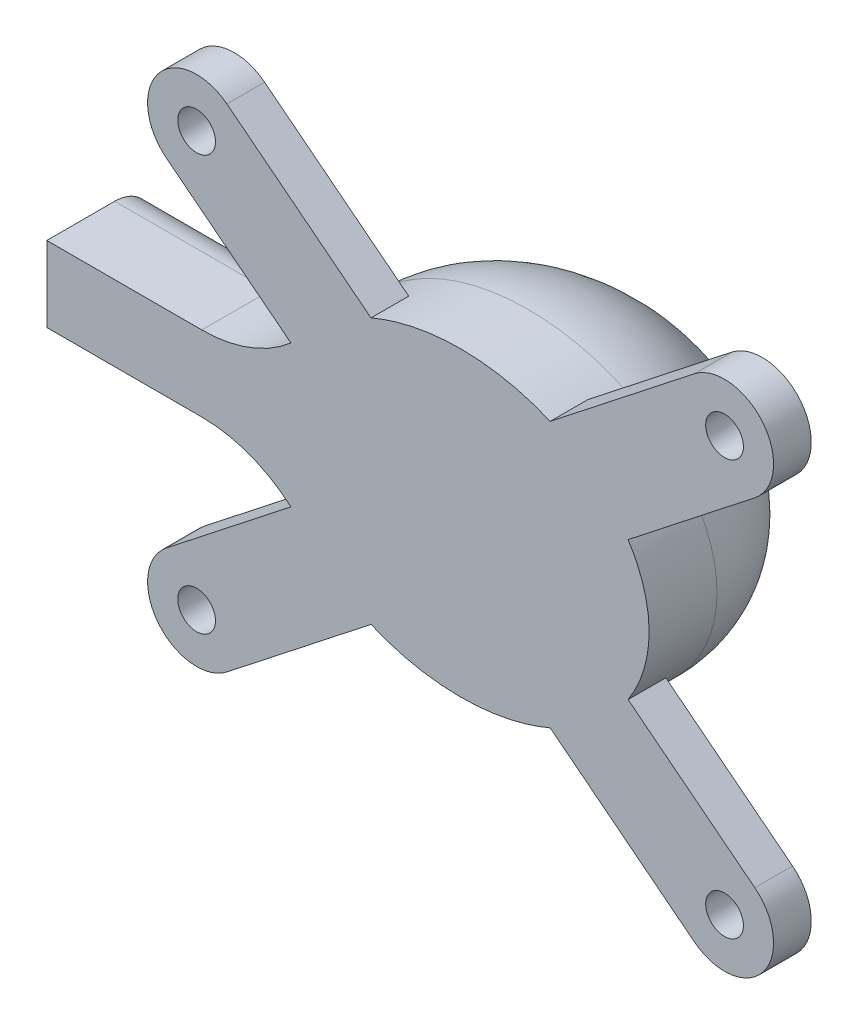
ISO-10303-21;
HEADER;
FILE_DESCRIPTION(('STEP AP214'),'2;1');
FILE_NAME('part.step','',(''),(''),'','','');
FILE_SCHEMA(('AUTOMOTIVE_DESIGN { 1 0 10303 214 1 1 1 1 }'));
ENDSEC;
DATA;
#1=APPLICATION_CONTEXT('core data for automotive mechanical design processes');
#2=APPLICATION_PROTOCOL_DEFINITION('international standard','automotive_design',2000,#1);
#3=PRODUCT_CONTEXT('',#1,'mechanical');
#4=PRODUCT('Part','Part','',(#3));
#5=PRODUCT_RELATED_PRODUCT_CATEGORY('part','',(#4));
#6=PRODUCT_DEFINITION_FORMATION('','',#4);
#7=PRODUCT_DEFINITION_CONTEXT('part definition',#1,'design');
#8=PRODUCT_DEFINITION('design','',#6,#7);
#9=PRODUCT_DEFINITION_SHAPE('','',#8);
#10=(LENGTH_UNIT() NAMED_UNIT(*) SI_UNIT(.MILLI.,.METRE.));
#11=(NAMED_UNIT(*) PLANE_ANGLE_UNIT() SI_UNIT($,.RADIAN.));
#12=(NAMED_UNIT(*) SI_UNIT($,.STERADIAN.) SOLID_ANGLE_UNIT());
#13=UNCERTAINTY_MEASURE_WITH_UNIT(LENGTH_MEASURE(1.E-05),#10,'distance_accuracy_value','');
#14=(GEOMETRIC_REPRESENTATION_CONTEXT(3) GLOBAL_UNCERTAINTY_ASSIGNED_CONTEXT((#13)) GLOBAL_UNIT_ASSIGNED_CONTEXT((#10,
#11,#12)) REPRESENTATION_CONTEXT('',''));
#15=CARTESIAN_POINT('',(0.,0.,0.));
#16=DIRECTION('',(0.,0.,1.));
#17=DIRECTION('',(1.,0.,0.));
#18=AXIS2_PLACEMENT_3D('',#15,#16,#17);
#19=CARTESIAN_POINT('',(-54.865727699422,-5.,9.));
#20=DIRECTION('',(0.,1.,0.));
#21=DIRECTION('',(0.,0.,1.));
#22=AXIS2_PLACEMENT_3D('',#19,#20,#21);
#23=PLANE('',#22);
#24=DIRECTION('',(-1.,0.,0.));
#25=VECTOR('',#24,1.);
#26=CARTESIAN_POINT('',(-14.6473229179582,-5.,0.));
#27=LINE('',#26,#25);
#28=CARTESIAN_POINT('',(-34.3060891721499,-5.,0.));
#29=VERTEX_POINT('',#28);
#30=CARTESIAN_POINT('',(-54.865727699422,-5.,0.));
#31=VERTEX_POINT('',#30);
#32=EDGE_CURVE('E296',#29,#31,#27,.T.);
#33=ORIENTED_EDGE('',*,*,#32,.F.);
#34=DIRECTION('',(0.,0.,1.));
#35=VECTOR('',#34,1.);
#36=CARTESIAN_POINT('',(-34.3060891721499,-5.,9.));
#37=LINE('',#36,#35);
#38=CARTESIAN_POINT('',(-34.3060891721499,-5.,9.));
#39=VERTEX_POINT('',#38);
#40=EDGE_CURVE('E364',#29,#39,#37,.T.);
#41=ORIENTED_EDGE('',*,*,#40,.T.);
#42=DIRECTION('',(1.,0.,0.));
#43=VECTOR('',#42,1.);
#44=CARTESIAN_POINT('',(-54.865727699422,-5.,9.));
#45=LINE('',#44,#43);
#46=CARTESIAN_POINT('',(-54.865727699422,-5.,9.));
#47=VERTEX_POINT('',#46);
#48=EDGE_CURVE('E280',#47,#39,#45,.T.);
#49=ORIENTED_EDGE('',*,*,#48,.F.);
#50=DIRECTION('',(0.,0.,-1.));
#51=VECTOR('',#50,1.);
#52=CARTESIAN_POINT('',(-54.865727699422,-5.,9.));
#53=LINE('',#52,#51);
#54=EDGE_CURVE('E290',#47,#31,#53,.T.);
#55=ORIENTED_EDGE('',*,*,#54,.T.);
#56=EDGE_LOOP('',(#33,#41,#49,#55));
#57=FACE_BOUND('',#56,.T.);
#58=ADVANCED_FACE('F39',(#57),#23,.F.);
#59=CARTESIAN_POINT('',(-54.865727699422,5.,9.));
#60=DIRECTION('',(0.,-1.,0.));
#61=DIRECTION('',(0.,0.,-1.));
#62=AXIS2_PLACEMENT_3D('',#59,#60,#61);
#63=PLANE('',#62);
#64=DIRECTION('',(-1.,0.,0.));
#65=VECTOR('',#64,1.);
#66=CARTESIAN_POINT('',(-54.865727699422,5.,9.));
#67=LINE('',#66,#65);
#68=CARTESIAN_POINT('',(-34.3060891721499,5.,9.));
#69=VERTEX_POINT('',#68);
#70=CARTESIAN_POINT('',(-54.865727699422,5.,9.));
#71=VERTEX_POINT('',#70);
#72=EDGE_CURVE('E283',#69,#71,#67,.T.);
#73=ORIENTED_EDGE('',*,*,#72,.F.);
#74=DIRECTION('',(0.,0.,1.));
#75=VECTOR('',#74,1.);
#76=CARTESIAN_POINT('',(-34.3060891721499,5.,0.));
#77=LINE('',#76,#75);
#78=CARTESIAN_POINT('',(-34.3060891721499,5.,0.));
#79=VERTEX_POINT('',#78);
#80=EDGE_CURVE('E396',#69,#79,#77,.F.);
#81=ORIENTED_EDGE('',*,*,#80,.T.);
#82=DIRECTION('',(-1.,0.,0.));
#83=VECTOR('',#82,1.);
#84=CARTESIAN_POINT('',(-14.6473229179582,5.,0.));
#85=LINE('',#84,#83);
#86=CARTESIAN_POINT('',(-54.865727699422,5.,0.));
#87=VERTEX_POINT('',#86);
#88=EDGE_CURVE('E293',#79,#87,#85,.T.);
#89=ORIENTED_EDGE('',*,*,#88,.T.);
#90=DIRECTION('',(0.,0.,-1.));
#91=VECTOR('',#90,1.);
#92=CARTESIAN_POINT('',(-54.865727699422,5.,9.));
#93=LINE('',#92,#91);
#94=EDGE_CURVE('E286',#71,#87,#93,.T.);
#95=ORIENTED_EDGE('',*,*,#94,.F.);
#96=EDGE_LOOP('',(#73,#81,#89,#95));
#97=FACE_BOUND('',#96,.T.);
#98=ADVANCED_FACE('F339',(#97),#63,.F.);
#99=CARTESIAN_POINT('',(-35.,-27.5,4.));
#100=DIRECTION('',(0.,0.,1.));
#101=DIRECTION('',(1.,0.,0.));
#102=AXIS2_PLACEMENT_3D('',#99,#100,#101);
#103=PLANE('',#102);
#104=CARTESIAN_POINT('',(0.,0.,4.));
#105=DIRECTION('',(0.,0.,1.));
#106=DIRECTION('',(1.,0.,0.));
#107=AXIS2_PLACEMENT_3D('',#104,#105,#106);
#108=ELLIPSE('',#107,25.,20.);
#109=CARTESIAN_POINT('',(22.2087408965514,-9.1833528618638,4.));
#110=VERTEX_POINT('',#109);
#111=CARTESIAN_POINT('',(11.8774528933401,-17.5986565444795,4.));
#112=VERTEX_POINT('',#111);
#113=EDGE_CURVE('E438',#110,#112,#108,.F.);
#114=ORIENTED_EDGE('',*,*,#113,.F.);
#115=DIRECTION('',(-0.786318338822423,0.617821551931903,0.));
#116=VECTOR('',#115,1.);
#117=CARTESIAN_POINT('',(10.5208372541793,0.,4.));
#118=LINE('',#117,#116);
#119=CARTESIAN_POINT('',(39.0158400875574,-22.3889307976542,4.));
#120=VERTEX_POINT('',#119);
#121=EDGE_CURVE('E499',#120,#110,#118,.T.);
#122=ORIENTED_EDGE('',*,*,#121,.F.);
#123=CARTESIAN_POINT('',(35.,-27.5,4.));
#124=DIRECTION('',(0.,0.,1.));
#125=DIRECTION('',(1.,0.,0.));
#126=AXIS2_PLACEMENT_3D('',#123,#124,#125);
#127=CIRCLE('',#126,6.50000000000001);
#128=CARTESIAN_POINT('',(30.9841599124426,-32.6110692023458,4.));
#129=VERTEX_POINT('',#128);
#130=EDGE_CURVE('E495',#129,#120,#127,.T.);
#131=ORIENTED_EDGE('',*,*,#130,.F.);
#132=DIRECTION('',(0.786318338822423,-0.617821551931903,0.));
#133=VECTOR('',#132,1.);
#134=CARTESIAN_POINT('',(0.,-8.2663721282837,4.));
#135=LINE('',#134,#133);
#136=EDGE_CURVE('E492',#112,#129,#135,.T.);
#137=ORIENTED_EDGE('',*,*,#136,.F.);
#138=EDGE_LOOP('',(#114,#122,#131,#137));
#139=FACE_BOUND('',#138,.T.);
#140=CARTESIAN_POINT('',(35.,-27.5,4.));
#141=DIRECTION('',(0.,0.,1.));
#142=DIRECTION('',(1.,0.,0.));
#143=AXIS2_PLACEMENT_3D('',#140,#141,#142);
#144=CIRCLE('',#143,2.5);
#145=CARTESIAN_POINT('',(37.5,-27.5,4.));
#146=VERTEX_POINT('',#145);
#147=EDGE_CURVE('E432',#146,#146,#144,.T.);
#148=ORIENTED_EDGE('',*,*,#147,.T.);
#149=EDGE_LOOP('',(#148));
#150=FACE_BOUND('',#149,.T.);
#151=ADVANCED_FACE('F345',(#139,#150),#103,.F.);
#152=DIRECTION('',(-0.786318338822423,-0.617821551931904,0.));
#153=VECTOR('',#152,1.);
#154=CARTESIAN_POINT('',(-39.0158400875574,-22.3889307976543,4.));
#155=LINE('',#154,#153);
#156=CARTESIAN_POINT('',(-22.500268423521,-9.4124102044828,4.));
#157=VERTEX_POINT('',#156);
#158=CARTESIAN_POINT('',(-39.0158400875574,-22.3889307976543,4.));
#159=VERTEX_POINT('',#158);
#160=EDGE_CURVE('E276',#157,#159,#155,.T.);
#161=ORIENTED_EDGE('',*,*,#160,.F.);
#162=CARTESIAN_POINT('',(-34.3060891721499,-23.,4.));
#163=DIRECTION('',(0.,0.,1.));
#164=DIRECTION('',(1.,0.,0.));
#165=AXIS2_PLACEMENT_3D('',#162,#163,#164);
#166=CIRCLE('',#165,18.);
#167=CARTESIAN_POINT('',(-20.6295359356946,-11.2973553599879,4.));
#168=VERTEX_POINT('',#167);
#169=EDGE_CURVE('E403',#157,#168,#166,.F.);
#170=ORIENTED_EDGE('',*,*,#169,.T.);
#171=CARTESIAN_POINT('',(-11.8774528933401,-17.5986565444795,4.));
#172=VERTEX_POINT('',#171);
#173=EDGE_CURVE('E428',#172,#168,#108,.F.);
#174=ORIENTED_EDGE('',*,*,#173,.F.);
#175=DIRECTION('',(0.786318338822423,0.617821551931903,0.));
#176=VECTOR('',#175,1.);
#177=CARTESIAN_POINT('',(-30.9841599124426,-32.6110692023458,4.));
#178=LINE('',#177,#176);
#179=CARTESIAN_POINT('',(-30.9841599124426,-32.6110692023458,4.));
#180=VERTEX_POINT('',#179);
#181=EDGE_CURVE('E488',#180,#172,#178,.T.);
#182=ORIENTED_EDGE('',*,*,#181,.F.);
#183=CARTESIAN_POINT('',(-35.,-27.5,4.));
#184=DIRECTION('',(0.,0.,1.));
#185=DIRECTION('',(1.,0.,0.));
#186=AXIS2_PLACEMENT_3D('',#183,#184,#185);
#187=CIRCLE('',#186,6.5);
#188=EDGE_CURVE('E248',#159,#180,#187,.T.);
#189=ORIENTED_EDGE('',*,*,#188,.F.);
#190=EDGE_LOOP('',(#161,#170,#174,#182,#189));
#191=FACE_BOUND('',#190,.T.);
#192=CARTESIAN_POINT('',(-35.,-27.5,4.));
#193=DIRECTION('',(0.,0.,1.));
#194=DIRECTION('',(1.,0.,0.));
#195=AXIS2_PLACEMENT_3D('',#192,#193,#194);
#196=CIRCLE('',#195,2.50000000000001);
#197=CARTESIAN_POINT('',(-32.5,-27.5,4.));
#198=VERTEX_POINT('',#197);
#199=EDGE_CURVE('E477',#198,#198,#196,.T.);
#200=ORIENTED_EDGE('',*,*,#199,.T.);
#201=EDGE_LOOP('',(#200));
#202=FACE_BOUND('',#201,.T.);
#203=ADVANCED_FACE('F580',(#191,#202),#103,.F.);
#204=CARTESIAN_POINT('',(-20.6295359356946,11.2973553599879,4.));
#205=VERTEX_POINT('',#204);
#206=CARTESIAN_POINT('',(-11.8774528933401,17.5986565444795,4.));
#207=VERTEX_POINT('',#206);
#208=EDGE_CURVE('E413',#205,#207,#108,.F.);
#209=ORIENTED_EDGE('',*,*,#208,.F.);
#210=CARTESIAN_POINT('',(-34.3060891721499,23.,4.));
#211=DIRECTION('',(0.,0.,1.));
#212=DIRECTION('',(1.,0.,0.));
#213=AXIS2_PLACEMENT_3D('',#210,#211,#212);
#214=CIRCLE('',#213,18.);
#215=CARTESIAN_POINT('',(-22.500268423521,9.41241020448278,4.));
#216=VERTEX_POINT('',#215);
#217=EDGE_CURVE('E390',#205,#216,#214,.F.);
#218=ORIENTED_EDGE('',*,*,#217,.T.);
#219=DIRECTION('',(0.786318338822423,-0.617821551931903,0.));
#220=VECTOR('',#219,1.);
#221=CARTESIAN_POINT('',(-39.0158400875574,22.3889307976542,4.));
#222=LINE('',#221,#220);
#223=CARTESIAN_POINT('',(-39.0158400875574,22.3889307976542,4.));
#224=VERTEX_POINT('',#223);
#225=EDGE_CURVE('E519',#224,#216,#222,.T.);
#226=ORIENTED_EDGE('',*,*,#225,.F.);
#227=CARTESIAN_POINT('',(-35.,27.5,4.));
#228=DIRECTION('',(0.,0.,1.));
#229=DIRECTION('',(1.,0.,0.));
#230=AXIS2_PLACEMENT_3D('',#227,#228,#229);
#231=CIRCLE('',#230,6.5);
#232=CARTESIAN_POINT('',(-30.9841599124426,32.6110692023457,4.));
#233=VERTEX_POINT('',#232);
#234=EDGE_CURVE('E515',#233,#224,#231,.T.);
#235=ORIENTED_EDGE('',*,*,#234,.F.);
#236=DIRECTION('',(-0.786318338822423,0.617821551931903,0.));
#237=VECTOR('',#236,1.);
#238=CARTESIAN_POINT('',(-30.9841599124426,32.6110692023457,4.));
#239=LINE('',#238,#237);
#240=EDGE_CURVE('E423',#207,#233,#239,.T.);
#241=ORIENTED_EDGE('',*,*,#240,.F.);
#242=EDGE_LOOP('',(#209,#218,#226,#235,#241));
#243=FACE_BOUND('',#242,.T.);
#244=CARTESIAN_POINT('',(-35.,27.5,4.));
#245=DIRECTION('',(0.,0.,1.));
#246=DIRECTION('',(1.,0.,0.));
#247=AXIS2_PLACEMENT_3D('',#244,#245,#246);
#248=CIRCLE('',#247,2.5);
#249=CARTESIAN_POINT('',(-32.5,27.5,4.));
#250=VERTEX_POINT('',#249);
#251=EDGE_CURVE('E469',#250,#250,#248,.T.);
#252=ORIENTED_EDGE('',*,*,#251,.T.);
#253=EDGE_LOOP('',(#252));
#254=FACE_BOUND('',#253,.T.);
#255=ADVANCED_FACE('F418',(#243,#254),#103,.F.);
#256=CARTESIAN_POINT('',(-39.0158400875574,-22.3889307976543,4.));
#257=DIRECTION('',(-0.617821551931904,0.786318338822423,0.));
#258=DIRECTION('',(-0.786318338822423,-0.617821551931904,0.));
#259=AXIS2_PLACEMENT_3D('',#256,#257,#258);
#260=PLANE('',#259);
#261=DIRECTION('',(-0.786318338822423,-0.617821551931904,0.));
#262=VECTOR('',#261,1.);
#263=CARTESIAN_POINT('',(-39.0158400875574,-22.3889307976543,9.));
#264=LINE('',#263,#262);
#265=CARTESIAN_POINT('',(-22.500268423521,-9.4124102044828,9.));
#266=VERTEX_POINT('',#265);
#267=CARTESIAN_POINT('',(-39.0158400875574,-22.3889307976543,9.));
#268=VERTEX_POINT('',#267);
#269=EDGE_CURVE('E245',#266,#268,#264,.T.);
#270=ORIENTED_EDGE('',*,*,#269,.F.);
#271=DIRECTION('',(0.,0.,-1.));
#272=VECTOR('',#271,1.);
#273=CARTESIAN_POINT('',(-22.500268423521,-9.4124102044828,9.));
#274=LINE('',#273,#272);
#275=EDGE_CURVE('E55',#266,#157,#274,.T.);
#276=ORIENTED_EDGE('',*,*,#275,.T.);
#277=ORIENTED_EDGE('',*,*,#160,.T.);
#278=DIRECTION('',(0.,0.,1.));
#279=VECTOR('',#278,1.);
#280=CARTESIAN_POINT('',(-39.0158400875574,-22.3889307976543,4.));
#281=LINE('',#280,#279);
#282=EDGE_CURVE('E249',#159,#268,#281,.T.);
#283=ORIENTED_EDGE('',*,*,#282,.T.);
#284=EDGE_LOOP('',(#270,#276,#277,#283));
#285=FACE_BOUND('',#284,.T.);
#286=ADVANCED_FACE('F583',(#285),#260,.T.);
#287=CARTESIAN_POINT('',(-39.0158400875574,22.3889307976542,4.));
#288=DIRECTION('',(-0.617821551931903,-0.786318338822423,0.));
#289=DIRECTION('',(0.786318338822423,-0.617821551931903,0.));
#290=AXIS2_PLACEMENT_3D('',#287,#288,#289);
#291=PLANE('',#290);
#292=ORIENTED_EDGE('',*,*,#225,.T.);
#293=DIRECTION('',(0.,0.,-1.));
#294=VECTOR('',#293,1.);
#295=CARTESIAN_POINT('',(-22.500268423521,9.41241020448278,4.));
#296=LINE('',#295,#294);
#297=CARTESIAN_POINT('',(-22.500268423521,9.41241020448278,9.));
#298=VERTEX_POINT('',#297);
#299=EDGE_CURVE('E393',#216,#298,#296,.F.);
#300=ORIENTED_EDGE('',*,*,#299,.T.);
#301=DIRECTION('',(0.786318338822423,-0.617821551931903,0.));
#302=VECTOR('',#301,1.);
#303=CARTESIAN_POINT('',(-39.0158400875574,22.3889307976542,9.));
#304=LINE('',#303,#302);
#305=CARTESIAN_POINT('',(-39.0158400875574,22.3889307976542,9.));
#306=VERTEX_POINT('',#305);
#307=EDGE_CURVE('E242',#306,#298,#304,.T.);
#308=ORIENTED_EDGE('',*,*,#307,.F.);
#309=DIRECTION('',(0.,0.,1.));
#310=VECTOR('',#309,1.);
#311=CARTESIAN_POINT('',(-39.0158400875574,22.3889307976542,4.));
#312=LINE('',#311,#310);
#313=EDGE_CURVE('E254',#224,#306,#312,.T.);
#314=ORIENTED_EDGE('',*,*,#313,.F.);
#315=EDGE_LOOP('',(#292,#300,#308,#314));
#316=FACE_BOUND('',#315,.T.);
#317=ADVANCED_FACE('F588',(#316),#291,.T.);
#318=CARTESIAN_POINT('',(-30.9841599124426,32.6110692023457,4.));
#319=DIRECTION('',(0.617821551931903,0.786318338822423,0.));
#320=DIRECTION('',(-0.786318338822423,0.617821551931903,0.));
#321=AXIS2_PLACEMENT_3D('',#318,#319,#320);
#322=PLANE('',#321);
#323=DIRECTION('',(-0.786318338822423,0.617821551931903,0.));
#324=VECTOR('',#323,1.);
#325=CARTESIAN_POINT('',(-30.9841599124426,32.6110692023457,9.));
#326=LINE('',#325,#324);
#327=CARTESIAN_POINT('',(-11.8774528933401,17.5986565444795,9.));
#328=VERTEX_POINT('',#327);
#329=CARTESIAN_POINT('',(-30.9841599124426,32.6110692023457,9.));
#330=VERTEX_POINT('',#329);
#331=EDGE_CURVE('E235',#328,#330,#326,.T.);
#332=ORIENTED_EDGE('',*,*,#331,.F.);
#333=DIRECTION('',(0.,0.,-1.));
#334=VECTOR('',#333,1.);
#335=CARTESIAN_POINT('',(-11.8774528933401,17.5986565444795,9.));
#336=LINE('',#335,#334);
#337=EDGE_CURVE('E426',#328,#207,#336,.T.);
#338=ORIENTED_EDGE('',*,*,#337,.T.);
#339=ORIENTED_EDGE('',*,*,#240,.T.);
#340=DIRECTION('',(0.,0.,1.));
#341=VECTOR('',#340,1.);
#342=CARTESIAN_POINT('',(-30.9841599124426,32.6110692023457,4.));
#343=LINE('',#342,#341);
#344=EDGE_CURVE('E257',#233,#330,#343,.T.);
#345=ORIENTED_EDGE('',*,*,#344,.T.);
#346=EDGE_LOOP('',(#332,#338,#339,#345));
#347=FACE_BOUND('',#346,.T.);
#348=ADVANCED_FACE('F715',(#347),#322,.T.);
#349=CARTESIAN_POINT('',(0.,8.26637212828368,4.));
#350=DIRECTION('',(-0.617821551931904,0.786318338822423,0.));
#351=DIRECTION('',(-0.786318338822423,-0.617821551931904,0.));
#352=AXIS2_PLACEMENT_3D('',#349,#350,#351);
#353=PLANE('',#352);
#354=DIRECTION('',(-0.786318338822423,-0.617821551931904,0.));
#355=VECTOR('',#354,1.);
#356=CARTESIAN_POINT('',(0.,8.26637212828368,4.));
#357=LINE('',#356,#355);
#358=CARTESIAN_POINT('',(30.9841599124426,32.6110692023457,4.));
#359=VERTEX_POINT('',#358);
#360=CARTESIAN_POINT('',(11.8774528933401,17.5986565444795,4.));
#361=VERTEX_POINT('',#360);
#362=EDGE_CURVE('E509',#359,#361,#357,.T.);
#363=ORIENTED_EDGE('',*,*,#362,.T.);
#364=DIRECTION('',(0.,0.,-1.));
#365=VECTOR('',#364,1.);
#366=CARTESIAN_POINT('',(11.8774528933401,17.5986565444795,9.));
#367=LINE('',#366,#365);
#368=CARTESIAN_POINT('',(11.8774528933401,17.5986565444795,9.));
#369=VERTEX_POINT('',#368);
#370=EDGE_CURVE('E434',#361,#369,#367,.F.);
#371=ORIENTED_EDGE('',*,*,#370,.T.);
#372=DIRECTION('',(-0.786318338822423,-0.617821551931904,0.));
#373=VECTOR('',#372,1.);
#374=CARTESIAN_POINT('',(0.,8.26637212828368,9.));
#375=LINE('',#374,#373);
#376=CARTESIAN_POINT('',(30.9841599124426,32.6110692023457,9.));
#377=VERTEX_POINT('',#376);
#378=EDGE_CURVE('E226',#377,#369,#375,.T.);
#379=ORIENTED_EDGE('',*,*,#378,.F.);
#380=DIRECTION('',(0.,0.,1.));
#381=VECTOR('',#380,1.);
#382=CARTESIAN_POINT('',(30.9841599124426,32.6110692023457,4.));
#383=LINE('',#382,#381);
#384=EDGE_CURVE('E261',#359,#377,#383,.T.);
#385=ORIENTED_EDGE('',*,*,#384,.F.);
#386=EDGE_LOOP('',(#363,#371,#379,#385));
#387=FACE_BOUND('',#386,.T.);
#388=ADVANCED_FACE('F552',(#387),#353,.T.);
#389=CARTESIAN_POINT('',(10.5208372541793,0.,4.));
#390=DIRECTION('',(0.617821551931904,-0.786318338822423,0.));
#391=DIRECTION('',(0.786318338822423,0.617821551931904,0.));
#392=AXIS2_PLACEMENT_3D('',#389,#390,#391);
#393=PLANE('',#392);
#394=DIRECTION('',(0.786318338822423,0.617821551931903,0.));
#395=VECTOR('',#394,1.);
#396=CARTESIAN_POINT('',(10.5208372541793,0.,9.));
#397=LINE('',#396,#395);
#398=CARTESIAN_POINT('',(22.2087408965514,9.18335286186378,9.));
#399=VERTEX_POINT('',#398);
#400=CARTESIAN_POINT('',(39.0158400875574,22.3889307976542,9.));
#401=VERTEX_POINT('',#400);
#402=EDGE_CURVE('E208',#399,#401,#397,.T.);
#403=ORIENTED_EDGE('',*,*,#402,.F.);
#404=DIRECTION('',(0.,0.,-1.));
#405=VECTOR('',#404,1.);
#406=CARTESIAN_POINT('',(22.2087408965514,9.18335286186379,9.));
#407=LINE('',#406,#405);
#408=CARTESIAN_POINT('',(22.2087408965514,9.18335286186379,4.));
#409=VERTEX_POINT('',#408);
#410=EDGE_CURVE('E190',#399,#409,#407,.T.);
#411=ORIENTED_EDGE('',*,*,#410,.T.);
#412=DIRECTION('',(0.786318338822423,0.617821551931903,0.));
#413=VECTOR('',#412,1.);
#414=CARTESIAN_POINT('',(10.5208372541793,0.,4.));
#415=LINE('',#414,#413);
#416=CARTESIAN_POINT('',(39.0158400875574,22.3889307976542,4.));
#417=VERTEX_POINT('',#416);
#418=EDGE_CURVE('E502',#409,#417,#415,.T.);
#419=ORIENTED_EDGE('',*,*,#418,.T.);
#420=DIRECTION('',(0.,0.,1.));
#421=VECTOR('',#420,1.);
#422=CARTESIAN_POINT('',(39.0158400875574,22.3889307976542,4.));
#423=LINE('',#422,#421);
#424=EDGE_CURVE('E219',#417,#401,#423,.T.);
#425=ORIENTED_EDGE('',*,*,#424,.T.);
#426=EDGE_LOOP('',(#403,#411,#419,#425));
#427=FACE_BOUND('',#426,.T.);
#428=ADVANCED_FACE('F217',(#427),#393,.T.);
#429=CARTESIAN_POINT('',(10.5208372541793,0.,4.));
#430=DIRECTION('',(0.617821551931903,0.786318338822423,0.));
#431=DIRECTION('',(-0.786318338822423,0.617821551931903,0.));
#432=AXIS2_PLACEMENT_3D('',#429,#430,#431);
#433=PLANE('',#432);
#434=ORIENTED_EDGE('',*,*,#121,.T.);
#435=DIRECTION('',(0.,0.,-1.));
#436=VECTOR('',#435,1.);
#437=CARTESIAN_POINT('',(22.2087408965514,-9.1833528618638,9.));
#438=LINE('',#437,#436);
#439=CARTESIAN_POINT('',(22.2087408965514,-9.1833528618638,9.));
#440=VERTEX_POINT('',#439);
#441=EDGE_CURVE('E201',#110,#440,#438,.F.);
#442=ORIENTED_EDGE('',*,*,#441,.T.);
#443=DIRECTION('',(-0.786318338822423,0.617821551931903,0.));
#444=VECTOR('',#443,1.);
#445=CARTESIAN_POINT('',(10.5208372541793,0.,9.));
#446=LINE('',#445,#444);
#447=CARTESIAN_POINT('',(39.0158400875574,-22.3889307976542,9.));
#448=VERTEX_POINT('',#447);
#449=EDGE_CURVE('E212',#448,#440,#446,.T.);
#450=ORIENTED_EDGE('',*,*,#449,.F.);
#451=DIRECTION('',(0.,0.,1.));
#452=VECTOR('',#451,1.);
#453=CARTESIAN_POINT('',(39.0158400875574,-22.3889307976542,4.));
#454=LINE('',#453,#452);
#455=EDGE_CURVE('E266',#120,#448,#454,.T.);
#456=ORIENTED_EDGE('',*,*,#455,.F.);
#457=EDGE_LOOP('',(#434,#442,#450,#456));
#458=FACE_BOUND('',#457,.T.);
#459=ADVANCED_FACE('F542',(#458),#433,.T.);
#460=CARTESIAN_POINT('',(0.,-8.2663721282837,4.));
#461=DIRECTION('',(-0.617821551931903,-0.786318338822423,0.));
#462=DIRECTION('',(0.786318338822423,-0.617821551931903,0.));
#463=AXIS2_PLACEMENT_3D('',#460,#461,#462);
#464=PLANE('',#463);
#465=DIRECTION('',(0.786318338822423,-0.617821551931903,0.));
#466=VECTOR('',#465,1.);
#467=CARTESIAN_POINT('',(0.,-8.2663721282837,9.));
#468=LINE('',#467,#466);
#469=CARTESIAN_POINT('',(11.8774528933401,-17.5986565444795,9.));
#470=VERTEX_POINT('',#469);
#471=CARTESIAN_POINT('',(30.9841599124426,-32.6110692023458,9.));
#472=VERTEX_POINT('',#471);
#473=EDGE_CURVE('E531',#470,#472,#468,.T.);
#474=ORIENTED_EDGE('',*,*,#473,.F.);
#475=DIRECTION('',(0.,0.,-1.));
#476=VECTOR('',#475,1.);
#477=CARTESIAN_POINT('',(11.8774528933401,-17.5986565444795,9.));
#478=LINE('',#477,#476);
#479=EDGE_CURVE('E441',#470,#112,#478,.T.);
#480=ORIENTED_EDGE('',*,*,#479,.T.);
#481=ORIENTED_EDGE('',*,*,#136,.T.);
#482=DIRECTION('',(0.,0.,1.));
#483=VECTOR('',#482,1.);
#484=CARTESIAN_POINT('',(30.9841599124426,-32.6110692023458,4.));
#485=LINE('',#484,#483);
#486=EDGE_CURVE('E269',#129,#472,#485,.T.);
#487=ORIENTED_EDGE('',*,*,#486,.T.);
#488=EDGE_LOOP('',(#474,#480,#481,#487));
#489=FACE_BOUND('',#488,.T.);
#490=ADVANCED_FACE('F544',(#489),#464,.T.);
#491=CARTESIAN_POINT('',(-30.9841599124426,-32.6110692023458,4.));
#492=DIRECTION('',(0.617821551931903,-0.786318338822423,0.));
#493=DIRECTION('',(0.786318338822423,0.617821551931903,0.));
#494=AXIS2_PLACEMENT_3D('',#491,#492,#493);
#495=PLANE('',#494);
#496=ORIENTED_EDGE('',*,*,#181,.T.);
#497=DIRECTION('',(0.,0.,-1.));
#498=VECTOR('',#497,1.);
#499=CARTESIAN_POINT('',(-11.8774528933401,-17.5986565444795,9.));
#500=LINE('',#499,#498);
#501=CARTESIAN_POINT('',(-11.8774528933401,-17.5986565444795,9.));
#502=VERTEX_POINT('',#501);
#503=EDGE_CURVE('E377',#172,#502,#500,.F.);
#504=ORIENTED_EDGE('',*,*,#503,.T.);
#505=DIRECTION('',(0.786318338822423,0.617821551931903,0.));
#506=VECTOR('',#505,1.);
#507=CARTESIAN_POINT('',(-30.9841599124426,-32.6110692023458,9.));
#508=LINE('',#507,#506);
#509=CARTESIAN_POINT('',(-30.9841599124426,-32.6110692023458,9.));
#510=VERTEX_POINT('',#509);
#511=EDGE_CURVE('E527',#510,#502,#508,.T.);
#512=ORIENTED_EDGE('',*,*,#511,.F.);
#513=DIRECTION('',(0.,0.,1.));
#514=VECTOR('',#513,1.);
#515=CARTESIAN_POINT('',(-30.9841599124426,-32.6110692023458,4.));
#516=LINE('',#515,#514);
#517=EDGE_CURVE('E273',#180,#510,#516,.T.);
#518=ORIENTED_EDGE('',*,*,#517,.F.);
#519=EDGE_LOOP('',(#496,#504,#512,#518));
#520=FACE_BOUND('',#519,.T.);
#521=ADVANCED_FACE('F320',(#520),#495,.T.);
#522=CARTESIAN_POINT('',(0.,0.,0.));
#523=DIRECTION('',(0.,0.,-1.));
#524=DIRECTION('',(1.,0.,0.));
#525=AXIS2_PLACEMENT_3D('',#522,#523,#524);
#526=ELLIPSE('',#525,25.,20.);
#527=TRIMMED_CURVE('',#526,(PARAMETER_VALUE(6.28318530717959)),
(PARAMETER_VALUE(9.42477796076938)),.T.,.PARAMETER.);
#528=CARTESIAN_POINT('',(25.,0.,0.));
#529=DIRECTION('',(1.,0.,0.));
#530=AXIS1_PLACEMENT('',#528,#529);
#531=SURFACE_OF_REVOLUTION('',#527,#530);
#532=CARTESIAN_POINT('',(25.,0.,0.));
#533=VERTEX_POINT('',#532);
#534=CARTESIAN_POINT('',(-20.6295359356946,-11.2973553599879,0.));
#535=VERTEX_POINT('',#534);
#536=EDGE_CURVE('E307',#533,#535,#526,.T.);
#537=ORIENTED_EDGE('',*,*,#536,.T.);
#538=CARTESIAN_POINT('',(-20.6295359356946,0.,0.));
#539=DIRECTION('',(1.,0.,0.));
#540=DIRECTION('',(0.,0.,-1.));
#541=AXIS2_PLACEMENT_3D('',#538,#539,#540);
#542=CIRCLE('',#541,11.2973553599879);
#543=CARTESIAN_POINT('',(-20.6295359356946,11.2973553599879,0.));
#544=VERTEX_POINT('',#543);
#545=EDGE_CURVE('E369',#535,#544,#542,.T.);
#546=ORIENTED_EDGE('',*,*,#545,.T.);
#547=CARTESIAN_POINT('',(0.,0.,0.));
#548=DIRECTION('',(0.,0.,1.));
#549=DIRECTION('',(1.,0.,0.));
#550=AXIS2_PLACEMENT_3D('',#547,#548,#549);
#551=ELLIPSE('',#550,25.,20.);
#552=EDGE_CURVE('E304',#533,#544,#551,.T.);
#553=ORIENTED_EDGE('',*,*,#552,.F.);
#554=EDGE_LOOP('',(#537,#546,#553));
#555=FACE_BOUND('',#554,.T.);
#556=ADVANCED_FACE('F315',(#555),#531,.F.);
#557=CARTESIAN_POINT('',(-54.865727699422,0.,0.));
#558=DIRECTION('',(-1.,0.,0.));
#559=DIRECTION('',(0.,0.,1.));
#560=AXIS2_PLACEMENT_3D('',#557,#558,#559);
#561=PLANE('',#560);
#562=CARTESIAN_POINT('',(-54.865727699422,0.,0.));
#563=DIRECTION('',(1.,0.,0.));
#564=DIRECTION('',(0.,0.,-1.));
#565=AXIS2_PLACEMENT_3D('',#562,#563,#564);
#566=CIRCLE('',#565,5.);
#567=EDGE_CURVE('E300',#31,#87,#566,.T.);
#568=ORIENTED_EDGE('',*,*,#567,.F.);
#569=ORIENTED_EDGE('',*,*,#54,.F.);
#570=DIRECTION('',(0.,-1.,0.));
#571=VECTOR('',#570,1.);
#572=CARTESIAN_POINT('',(-54.865727699422,-5.,9.));
#573=LINE('',#572,#571);
#574=EDGE_CURVE('E253',#71,#47,#573,.T.);
#575=ORIENTED_EDGE('',*,*,#574,.F.);
#576=ORIENTED_EDGE('',*,*,#94,.T.);
#577=EDGE_LOOP('',(#568,#569,#575,#576));
#578=FACE_BOUND('',#577,.T.);
#579=ADVANCED_FACE('F319',(#578),#561,.T.);
#580=CARTESIAN_POINT('',(-14.6473229179582,0.,0.));
#581=DIRECTION('',(1.,0.,0.));
#582=DIRECTION('',(0.,0.,-1.));
#583=AXIS2_PLACEMENT_3D('',#580,#581,#582);
#584=CYLINDRICAL_SURFACE('',#583,5.);
#585=ORIENTED_EDGE('',*,*,#88,.F.);
#586=CARTESIAN_POINT('',(-34.3060891721499,0.,0.));
#587=DIRECTION('',(-1.,0.,0.));
#588=DIRECTION('',(0.,0.,1.));
#589=AXIS2_PLACEMENT_3D('',#586,#587,#588);
#590=CIRCLE('',#589,5.);
#591=EDGE_CURVE('E312',#79,#29,#590,.T.);
#592=ORIENTED_EDGE('',*,*,#591,.T.);
#593=ORIENTED_EDGE('',*,*,#32,.T.);
#594=ORIENTED_EDGE('',*,*,#567,.T.);
#595=EDGE_LOOP('',(#585,#592,#593,#594));
#596=FACE_BOUND('',#595,.T.);
#597=ADVANCED_FACE('F322',(#596),#584,.T.);
#598=CARTESIAN_POINT('',(-34.3060891721499,0.,0.));
#599=DIRECTION('',(-1.,0.,0.));
#600=DIRECTION('',(0.,0.,1.));
#601=AXIS2_PLACEMENT_3D('',#598,#599,#600);
#602=TOROIDAL_SURFACE('',#601,23.,18.);
#603=CARTESIAN_POINT('',(-34.3060891721499,23.,-1.60608141586784E-13));
#604=DIRECTION('',(0.,0.,-1.));
#605=DIRECTION('',(0.,1.,0.));
#606=AXIS2_PLACEMENT_3D('',#603,#604,#605);
#607=CIRCLE('',#606,18.);
#608=EDGE_CURVE('E373',#544,#79,#607,.T.);
#609=ORIENTED_EDGE('',*,*,#608,.F.);
#610=ORIENTED_EDGE('',*,*,#545,.F.);
#611=CARTESIAN_POINT('',(-34.3060891721499,-23.,1.60608141586784E-13));
#612=DIRECTION('',(0.,0.,-1.));
#613=DIRECTION('',(0.,1.,0.));
#614=AXIS2_PLACEMENT_3D('',#611,#612,#613);
#615=CIRCLE('',#614,18.);
#616=EDGE_CURVE('E366',#29,#535,#615,.T.);
#617=ORIENTED_EDGE('',*,*,#616,.F.);
#618=ORIENTED_EDGE('',*,*,#591,.F.);
#619=EDGE_LOOP('',(#609,#610,#617,#618));
#620=FACE_BOUND('',#619,.T.);
#621=ADVANCED_FACE('F324',(#620),#602,.F.);
#622=CARTESIAN_POINT('',(0.,0.,9.));
#623=DIRECTION('',(0.,0.,-1.));
#624=DIRECTION('',(-1.,0.,0.));
#625=AXIS2_PLACEMENT_3D('',#622,#623,#624);
#626=PLANE('',#625);
#627=ORIENTED_EDGE('',*,*,#307,.T.);
#628=CARTESIAN_POINT('',(-34.3060891721499,23.,9.));
#629=DIRECTION('',(0.,0.,-1.));
#630=DIRECTION('',(-1.,0.,0.));
#631=AXIS2_PLACEMENT_3D('',#628,#629,#630);
#632=CIRCLE('',#631,18.);
#633=EDGE_CURVE('E48',#298,#69,#632,.T.);
#634=ORIENTED_EDGE('',*,*,#633,.T.);
#635=ORIENTED_EDGE('',*,*,#72,.T.);
#636=ORIENTED_EDGE('',*,*,#574,.T.);
#637=ORIENTED_EDGE('',*,*,#48,.T.);
#638=CARTESIAN_POINT('',(-34.3060891721499,-23.,9.));
#639=DIRECTION('',(0.,0.,-1.));
#640=DIRECTION('',(-1.,0.,0.));
#641=AXIS2_PLACEMENT_3D('',#638,#639,#640);
#642=CIRCLE('',#641,18.);
#643=EDGE_CURVE('E11',#39,#266,#642,.T.);
#644=ORIENTED_EDGE('',*,*,#643,.T.);
#645=ORIENTED_EDGE('',*,*,#269,.T.);
#646=CARTESIAN_POINT('',(-35.,-27.5,9.));
#647=DIRECTION('',(0.,0.,1.));
#648=DIRECTION('',(1.,0.,0.));
#649=AXIS2_PLACEMENT_3D('',#646,#647,#648);
#650=CIRCLE('',#649,6.5);
#651=EDGE_CURVE('E481',#268,#510,#650,.T.);
#652=ORIENTED_EDGE('',*,*,#651,.T.);
#653=ORIENTED_EDGE('',*,*,#511,.T.);
#654=CARTESIAN_POINT('',(0.,0.,9.));
#655=DIRECTION('',(0.,0.,1.));
#656=DIRECTION('',(1.,0.,0.));
#657=AXIS2_PLACEMENT_3D('',#654,#655,#656);
#658=ELLIPSE('',#657,25.,20.);
#659=EDGE_CURVE('E214',#502,#470,#658,.T.);
#660=ORIENTED_EDGE('',*,*,#659,.T.);
#661=ORIENTED_EDGE('',*,*,#473,.T.);
#662=CARTESIAN_POINT('',(35.,-27.5,9.));
#663=DIRECTION('',(0.,0.,1.));
#664=DIRECTION('',(1.,0.,0.));
#665=AXIS2_PLACEMENT_3D('',#662,#663,#664);
#666=CIRCLE('',#665,6.50000000000001);
#667=EDGE_CURVE('E228',#472,#448,#666,.T.);
#668=ORIENTED_EDGE('',*,*,#667,.T.);
#669=ORIENTED_EDGE('',*,*,#449,.T.);
#670=EDGE_CURVE('E193',#440,#399,#658,.T.);
#671=ORIENTED_EDGE('',*,*,#670,.T.);
#672=ORIENTED_EDGE('',*,*,#402,.T.);
#673=CARTESIAN_POINT('',(35.,27.5,9.));
#674=DIRECTION('',(0.,0.,1.));
#675=DIRECTION('',(1.,0.,0.));
#676=AXIS2_PLACEMENT_3D('',#673,#674,#675);
#677=CIRCLE('',#676,6.50000000000001);
#678=EDGE_CURVE('E222',#401,#377,#677,.T.);
#679=ORIENTED_EDGE('',*,*,#678,.T.);
#680=ORIENTED_EDGE('',*,*,#378,.T.);
#681=EDGE_CURVE('E216',#369,#328,#658,.T.);
#682=ORIENTED_EDGE('',*,*,#681,.T.);
#683=ORIENTED_EDGE('',*,*,#331,.T.);
#684=CARTESIAN_POINT('',(-35.,27.5,9.));
#685=DIRECTION('',(0.,0.,1.));
#686=DIRECTION('',(1.,0.,0.));
#687=AXIS2_PLACEMENT_3D('',#684,#685,#686);
#688=CIRCLE('',#687,6.5);
#689=EDGE_CURVE('E238',#330,#306,#688,.T.);
#690=ORIENTED_EDGE('',*,*,#689,.T.);
#691=EDGE_LOOP('',(#627,#634,#635,#636,#637,#644,#645,#652,#653,#660,#661,#668,#669,#671,#672,
#679,#680,#682,#683,#690));
#692=FACE_BOUND('',#691,.T.);
#693=CARTESIAN_POINT('',(35.,-27.5,9.));
#694=DIRECTION('',(0.,0.,1.));
#695=DIRECTION('',(1.,0.,0.));
#696=AXIS2_PLACEMENT_3D('',#693,#694,#695);
#697=CIRCLE('',#696,2.5);
#698=CARTESIAN_POINT('',(37.5,-27.5,9.));
#699=VERTEX_POINT('',#698);
#700=EDGE_CURVE('E425',#699,#699,#697,.T.);
#701=ORIENTED_EDGE('',*,*,#700,.F.);
#702=EDGE_LOOP('',(#701));
#703=FACE_BOUND('',#702,.T.);
#704=CARTESIAN_POINT('',(-35.,-27.5,9.));
#705=DIRECTION('',(0.,0.,1.));
#706=DIRECTION('',(1.,0.,0.));
#707=AXIS2_PLACEMENT_3D('',#704,#705,#706);
#708=CIRCLE('',#707,2.50000000000001);
#709=CARTESIAN_POINT('',(-32.5,-27.5,9.));
#710=VERTEX_POINT('',#709);
#711=EDGE_CURVE('E473',#710,#710,#708,.T.);
#712=ORIENTED_EDGE('',*,*,#711,.F.);
#713=EDGE_LOOP('',(#712));
#714=FACE_BOUND('',#713,.T.);
#715=CARTESIAN_POINT('',(-35.,27.5,9.));
#716=DIRECTION('',(0.,0.,1.));
#717=DIRECTION('',(1.,0.,0.));
#718=AXIS2_PLACEMENT_3D('',#715,#716,#717);
#719=CIRCLE('',#718,2.5);
#720=CARTESIAN_POINT('',(-32.5,27.5,9.));
#721=VERTEX_POINT('',#720);
#722=EDGE_CURVE('E465',#721,#721,#719,.T.);
#723=ORIENTED_EDGE('',*,*,#722,.F.);
#724=EDGE_LOOP('',(#723));
#725=FACE_BOUND('',#724,.T.);
#726=CARTESIAN_POINT('',(35.,27.5,9.));
#727=DIRECTION('',(0.,0.,1.));
#728=DIRECTION('',(1.,0.,0.));
#729=AXIS2_PLACEMENT_3D('',#726,#727,#728);
#730=CIRCLE('',#729,2.49999999999999);
#731=CARTESIAN_POINT('',(37.5,27.5,9.));
#732=VERTEX_POINT('',#731);
#733=EDGE_CURVE('E459',#732,#732,#730,.T.);
#734=ORIENTED_EDGE('',*,*,#733,.F.);
#735=EDGE_LOOP('',(#734));
#736=FACE_BOUND('',#735,.T.);
#737=ADVANCED_FACE('F205',(#692,#703,#714,#725,#736),#626,.F.);
#738=EDGE_CURVE('E196',#361,#409,#108,.F.);
#739=ORIENTED_EDGE('',*,*,#738,.F.);
#740=ORIENTED_EDGE('',*,*,#362,.F.);
#741=CARTESIAN_POINT('',(35.,27.5,4.));
#742=DIRECTION('',(0.,0.,1.));
#743=DIRECTION('',(1.,0.,0.));
#744=AXIS2_PLACEMENT_3D('',#741,#742,#743);
#745=CIRCLE('',#744,6.50000000000001);
#746=EDGE_CURVE('E505',#417,#359,#745,.T.);
#747=ORIENTED_EDGE('',*,*,#746,.F.);
#748=ORIENTED_EDGE('',*,*,#418,.F.);
#749=EDGE_LOOP('',(#739,#740,#747,#748));
#750=FACE_BOUND('',#749,.T.);
#751=CARTESIAN_POINT('',(35.,27.5,4.));
#752=DIRECTION('',(0.,0.,1.));
#753=DIRECTION('',(1.,0.,0.));
#754=AXIS2_PLACEMENT_3D('',#751,#752,#753);
#755=CIRCLE('',#754,2.49999999999999);
#756=CARTESIAN_POINT('',(37.5,27.5,4.));
#757=VERTEX_POINT('',#756);
#758=EDGE_CURVE('E461',#757,#757,#755,.T.);
#759=ORIENTED_EDGE('',*,*,#758,.T.);
#760=EDGE_LOOP('',(#759));
#761=FACE_BOUND('',#760,.T.);
#762=ADVANCED_FACE('F566',(#750,#761),#103,.F.);
#763=CARTESIAN_POINT('',(-35.,-27.5,4.));
#764=DIRECTION('',(0.,0.,1.));
#765=DIRECTION('',(1.,0.,0.));
#766=AXIS2_PLACEMENT_3D('',#763,#764,#765);
#767=CYLINDRICAL_SURFACE('',#766,6.5);
#768=ORIENTED_EDGE('',*,*,#651,.F.);
#769=ORIENTED_EDGE('',*,*,#282,.F.);
#770=ORIENTED_EDGE('',*,*,#188,.T.);
#771=ORIENTED_EDGE('',*,*,#517,.T.);
#772=EDGE_LOOP('',(#768,#769,#770,#771));
#773=FACE_BOUND('',#772,.T.);
#774=ADVANCED_FACE('F563',(#773),#767,.T.);
#775=CARTESIAN_POINT('',(-35.,27.5,4.));
#776=DIRECTION('',(0.,0.,1.));
#777=DIRECTION('',(1.,0.,0.));
#778=AXIS2_PLACEMENT_3D('',#775,#776,#777);
#779=CYLINDRICAL_SURFACE('',#778,6.5);
#780=ORIENTED_EDGE('',*,*,#689,.F.);
#781=ORIENTED_EDGE('',*,*,#344,.F.);
#782=ORIENTED_EDGE('',*,*,#234,.T.);
#783=ORIENTED_EDGE('',*,*,#313,.T.);
#784=EDGE_LOOP('',(#780,#781,#782,#783));
#785=FACE_BOUND('',#784,.T.);
#786=ADVANCED_FACE('F565',(#785),#779,.T.);
#787=CARTESIAN_POINT('',(35.,27.5,4.));
#788=DIRECTION('',(0.,0.,1.));
#789=DIRECTION('',(1.,0.,0.));
#790=AXIS2_PLACEMENT_3D('',#787,#788,#789);
#791=CYLINDRICAL_SURFACE('',#790,6.50000000000001);
#792=ORIENTED_EDGE('',*,*,#678,.F.);
#793=ORIENTED_EDGE('',*,*,#424,.F.);
#794=ORIENTED_EDGE('',*,*,#746,.T.);
#795=ORIENTED_EDGE('',*,*,#384,.T.);
#796=EDGE_LOOP('',(#792,#793,#794,#795));
#797=FACE_BOUND('',#796,.T.);
#798=ADVANCED_FACE('F558',(#797),#791,.T.);
#799=CARTESIAN_POINT('',(35.,-27.5,4.));
#800=DIRECTION('',(0.,0.,1.));
#801=DIRECTION('',(1.,0.,0.));
#802=AXIS2_PLACEMENT_3D('',#799,#800,#801);
#803=CYLINDRICAL_SURFACE('',#802,6.50000000000001);
#804=ORIENTED_EDGE('',*,*,#667,.F.);
#805=ORIENTED_EDGE('',*,*,#486,.F.);
#806=ORIENTED_EDGE('',*,*,#130,.T.);
#807=ORIENTED_EDGE('',*,*,#455,.T.);
#808=EDGE_LOOP('',(#804,#805,#806,#807));
#809=FACE_BOUND('',#808,.T.);
#810=ADVANCED_FACE('F539',(#809),#803,.T.);
#811=CARTESIAN_POINT('',(-35.,-27.5,4.));
#812=DIRECTION('',(0.,0.,1.));
#813=DIRECTION('',(1.,0.,0.));
#814=AXIS2_PLACEMENT_3D('',#811,#812,#813);
#815=CYLINDRICAL_SURFACE('',#814,2.50000000000001);
#816=ORIENTED_EDGE('',*,*,#199,.F.);
#817=EDGE_LOOP('',(#816));
#818=FACE_BOUND('',#817,.T.);
#819=ORIENTED_EDGE('',*,*,#711,.T.);
#820=EDGE_LOOP('',(#819));
#821=FACE_BOUND('',#820,.T.);
#822=ADVANCED_FACE('F557',(#818,#821),#815,.F.);
#823=CARTESIAN_POINT('',(-35.,27.5,4.));
#824=DIRECTION('',(0.,0.,1.));
#825=DIRECTION('',(1.,0.,0.));
#826=AXIS2_PLACEMENT_3D('',#823,#824,#825);
#827=CYLINDRICAL_SURFACE('',#826,2.5);
#828=ORIENTED_EDGE('',*,*,#251,.F.);
#829=EDGE_LOOP('',(#828));
#830=FACE_BOUND('',#829,.T.);
#831=ORIENTED_EDGE('',*,*,#722,.T.);
#832=EDGE_LOOP('',(#831));
#833=FACE_BOUND('',#832,.T.);
#834=ADVANCED_FACE('F599',(#830,#833),#827,.F.);
#835=CARTESIAN_POINT('',(35.,27.5,4.));
#836=DIRECTION('',(0.,0.,1.));
#837=DIRECTION('',(1.,0.,0.));
#838=AXIS2_PLACEMENT_3D('',#835,#836,#837);
#839=CYLINDRICAL_SURFACE('',#838,2.49999999999999);
#840=ORIENTED_EDGE('',*,*,#758,.F.);
#841=EDGE_LOOP('',(#840));
#842=FACE_BOUND('',#841,.T.);
#843=ORIENTED_EDGE('',*,*,#733,.T.);
#844=EDGE_LOOP('',(#843));
#845=FACE_BOUND('',#844,.T.);
#846=ADVANCED_FACE('F607',(#842,#845),#839,.F.);
#847=CARTESIAN_POINT('',(35.,-27.5,4.));
#848=DIRECTION('',(0.,0.,1.));
#849=DIRECTION('',(1.,0.,0.));
#850=AXIS2_PLACEMENT_3D('',#847,#848,#849);
#851=CYLINDRICAL_SURFACE('',#850,2.5);
#852=ORIENTED_EDGE('',*,*,#147,.F.);
#853=EDGE_LOOP('',(#852));
#854=FACE_BOUND('',#853,.T.);
#855=ORIENTED_EDGE('',*,*,#700,.T.);
#856=EDGE_LOOP('',(#855));
#857=FACE_BOUND('',#856,.T.);
#858=ADVANCED_FACE('F335',(#854,#857),#851,.F.);
#859=DIRECTION('',(0.,0.,-1.));
#860=VECTOR('',#859,1.);
#861=SURFACE_OF_LINEAR_EXTRUSION('',#658,#860);
#862=ORIENTED_EDGE('',*,*,#552,.T.);
#863=DIRECTION('',(0.,0.,-1.));
#864=VECTOR('',#863,1.);
#865=CARTESIAN_POINT('',(-20.6295359356946,11.2973553599879,0.));
#866=LINE('',#865,#864);
#867=EDGE_CURVE('E386',#544,#205,#866,.F.);
#868=ORIENTED_EDGE('',*,*,#867,.T.);
#869=ORIENTED_EDGE('',*,*,#208,.T.);
#870=ORIENTED_EDGE('',*,*,#337,.F.);
#871=ORIENTED_EDGE('',*,*,#681,.F.);
#872=ORIENTED_EDGE('',*,*,#370,.F.);
#873=ORIENTED_EDGE('',*,*,#738,.T.);
#874=ORIENTED_EDGE('',*,*,#410,.F.);
#875=ORIENTED_EDGE('',*,*,#670,.F.);
#876=ORIENTED_EDGE('',*,*,#441,.F.);
#877=ORIENTED_EDGE('',*,*,#113,.T.);
#878=ORIENTED_EDGE('',*,*,#479,.F.);
#879=ORIENTED_EDGE('',*,*,#659,.F.);
#880=ORIENTED_EDGE('',*,*,#503,.F.);
#881=ORIENTED_EDGE('',*,*,#173,.T.);
#882=DIRECTION('',(0.,0.,-1.));
#883=VECTOR('',#882,1.);
#884=CARTESIAN_POINT('',(-20.6295359356946,-11.2973553599879,4.));
#885=LINE('',#884,#883);
#886=EDGE_CURVE('E383',#168,#535,#885,.T.);
#887=ORIENTED_EDGE('',*,*,#886,.T.);
#888=ORIENTED_EDGE('',*,*,#536,.F.);
#889=EDGE_LOOP('',(#862,#868,#869,#870,#871,#872,#873,#874,#875,#876,#877,#878,#879,#880,#881,
#887,#888));
#890=FACE_BOUND('',#889,.T.);
#891=ADVANCED_FACE('F192',(#890),#861,.F.);
#892=CARTESIAN_POINT('',(-34.3060891721499,23.,4.5));
#893=DIRECTION('',(0.,0.,-1.));
#894=DIRECTION('',(-1.,0.,0.));
#895=AXIS2_PLACEMENT_3D('',#892,#893,#894);
#896=CYLINDRICAL_SURFACE('',#895,18.);
#897=ORIENTED_EDGE('',*,*,#608,.T.);
#898=ORIENTED_EDGE('',*,*,#80,.F.);
#899=ORIENTED_EDGE('',*,*,#633,.F.);
#900=ORIENTED_EDGE('',*,*,#299,.F.);
#901=ORIENTED_EDGE('',*,*,#217,.F.);
#902=ORIENTED_EDGE('',*,*,#867,.F.);
#903=EDGE_LOOP('',(#897,#898,#899,#900,#901,#902));
#904=FACE_BOUND('',#903,.T.);
#905=ADVANCED_FACE('F327',(#904),#896,.F.);
#906=CARTESIAN_POINT('',(-34.3060891721499,-23.,4.5));
#907=DIRECTION('',(0.,0.,-1.));
#908=DIRECTION('',(-1.,0.,0.));
#909=AXIS2_PLACEMENT_3D('',#906,#907,#908);
#910=CYLINDRICAL_SURFACE('',#909,18.);
#911=ORIENTED_EDGE('',*,*,#643,.F.);
#912=ORIENTED_EDGE('',*,*,#40,.F.);
#913=ORIENTED_EDGE('',*,*,#616,.T.);
#914=ORIENTED_EDGE('',*,*,#886,.F.);
#915=ORIENTED_EDGE('',*,*,#169,.F.);
#916=ORIENTED_EDGE('',*,*,#275,.F.);
#917=EDGE_LOOP('',(#911,#912,#913,#914,#915,#916));
#918=FACE_BOUND('',#917,.T.);
#919=ADVANCED_FACE('F41',(#918),#910,.F.);
#920=CLOSED_SHELL('',(#58,#98,#151,#203,#255,#286,#317,#348,#388,#428,#459,#490,#521,#556,#579,
#597,#621,#737,#762,#774,#786,#798,#810,#822,#834,#846,#858,#891,#905,#919));
#921=MANIFOLD_SOLID_BREP('B2',#920);
#922=ADVANCED_BREP_SHAPE_REPRESENTATION('',(#18,#921),#14);
#923=SHAPE_DEFINITION_REPRESENTATION(#9,#922);
ENDSEC;
END-ISO-10303-21;
